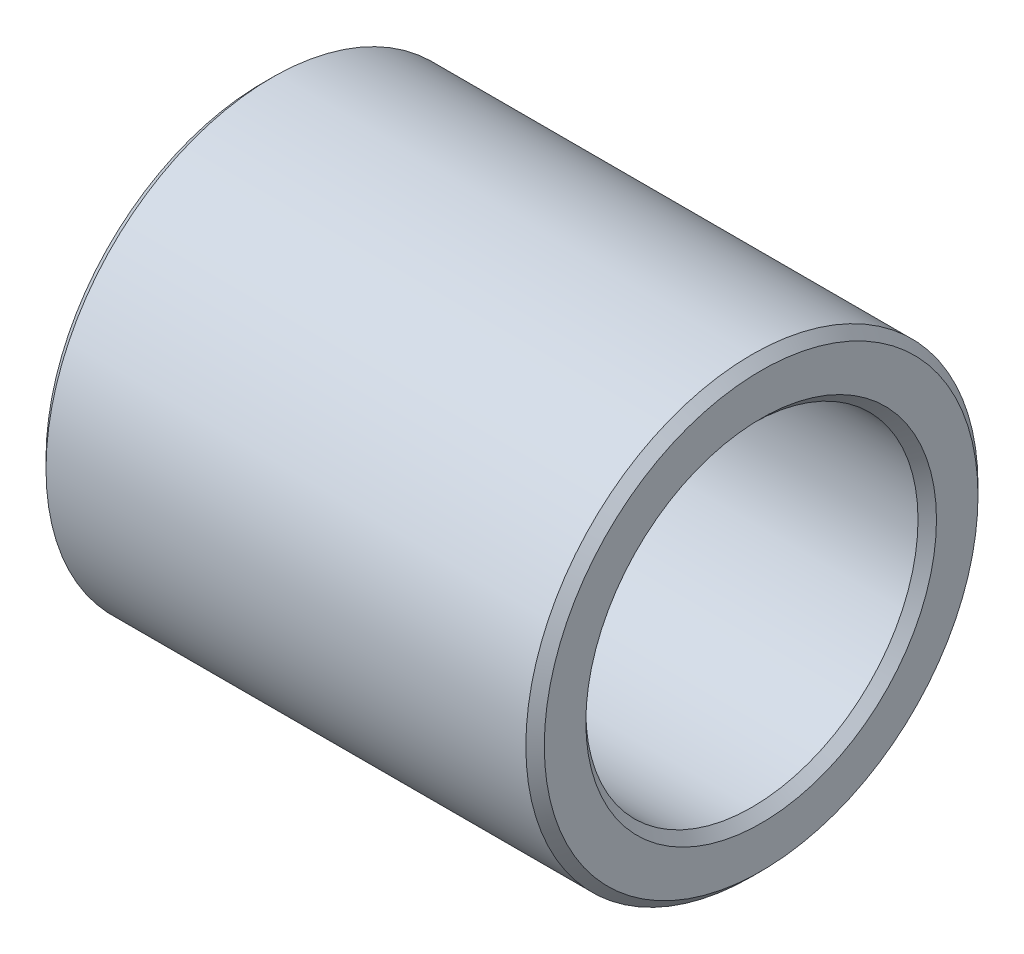
ISO-10303-21;
HEADER;
FILE_DESCRIPTION(('STEP AP214'),'2;1');
FILE_NAME('part.step','',(''),(''),'','','');
FILE_SCHEMA(('AUTOMOTIVE_DESIGN { 1 0 10303 214 1 1 1 1 }'));
ENDSEC;
DATA;
#1=APPLICATION_CONTEXT('core data for automotive mechanical design processes');
#2=APPLICATION_PROTOCOL_DEFINITION('international standard','automotive_design',2000,#1);
#3=PRODUCT_CONTEXT('',#1,'mechanical');
#4=PRODUCT('Part','Part','',(#3));
#5=PRODUCT_RELATED_PRODUCT_CATEGORY('part','',(#4));
#6=PRODUCT_DEFINITION_FORMATION('','',#4);
#7=PRODUCT_DEFINITION_CONTEXT('part definition',#1,'design');
#8=PRODUCT_DEFINITION('design','',#6,#7);
#9=PRODUCT_DEFINITION_SHAPE('','',#8);
#10=(LENGTH_UNIT() NAMED_UNIT(*) SI_UNIT(.MILLI.,.METRE.));
#11=(NAMED_UNIT(*) PLANE_ANGLE_UNIT() SI_UNIT($,.RADIAN.));
#12=(NAMED_UNIT(*) SI_UNIT($,.STERADIAN.) SOLID_ANGLE_UNIT());
#13=UNCERTAINTY_MEASURE_WITH_UNIT(LENGTH_MEASURE(1.E-05),#10,'distance_accuracy_value','');
#14=(GEOMETRIC_REPRESENTATION_CONTEXT(3) GLOBAL_UNCERTAINTY_ASSIGNED_CONTEXT((#13)) GLOBAL_UNIT_ASSIGNED_CONTEXT((#10,
#11,#12)) REPRESENTATION_CONTEXT('',''));
#15=CARTESIAN_POINT('',(0.,0.,0.));
#16=DIRECTION('',(0.,0.,1.));
#17=DIRECTION('',(1.,0.,0.));
#18=AXIS2_PLACEMENT_3D('',#15,#16,#17);
#19=CARTESIAN_POINT('',(0.,0.,0.));
#20=DIRECTION('',(-1.,0.,0.));
#21=DIRECTION('',(0.,0.,1.));
#22=AXIS2_PLACEMENT_3D('',#19,#20,#21);
#23=CYLINDRICAL_SURFACE('',#22,9.00000000000001);
#24=CARTESIAN_POINT('',(-13.,0.,0.));
#25=DIRECTION('',(-1.,0.,0.));
#26=DIRECTION('',(0.,0.,1.));
#27=AXIS2_PLACEMENT_3D('',#24,#25,#26);
#28=CIRCLE('',#27,9.00000000000001);
#29=CARTESIAN_POINT('',(-13.,0.,9.00000000000001));
#30=VERTEX_POINT('',#29);
#31=EDGE_CURVE('E56',#30,#30,#28,.T.);
#32=ORIENTED_EDGE('',*,*,#31,.T.);
#33=EDGE_LOOP('',(#32));
#34=FACE_BOUND('',#33,.T.);
#35=CARTESIAN_POINT('',(13.,0.,0.));
#36=DIRECTION('',(1.,0.,0.));
#37=DIRECTION('',(0.,0.,-1.));
#38=AXIS2_PLACEMENT_3D('',#35,#36,#37);
#39=CIRCLE('',#38,9.00000000000001);
#40=CARTESIAN_POINT('',(13.,0.,-9.00000000000001));
#41=VERTEX_POINT('',#40);
#42=EDGE_CURVE('E59',#41,#41,#39,.T.);
#43=ORIENTED_EDGE('',*,*,#42,.T.);
#44=EDGE_LOOP('',(#43));
#45=FACE_BOUND('',#44,.T.);
#46=ADVANCED_FACE('F31',(#34,#45),#23,.F.);
#47=CARTESIAN_POINT('',(-13.5,9.,0.));
#48=DIRECTION('',(-1.,0.,0.));
#49=DIRECTION('',(0.,0.,1.));
#50=AXIS2_PLACEMENT_3D('',#47,#48,#49);
#51=PLANE('',#50);
#52=CARTESIAN_POINT('',(-13.5,0.,0.));
#53=DIRECTION('',(-1.,0.,0.));
#54=DIRECTION('',(0.,0.,1.));
#55=AXIS2_PLACEMENT_3D('',#52,#53,#54);
#56=CIRCLE('',#55,9.50000000000001);
#57=CARTESIAN_POINT('',(-13.5,0.,9.50000000000001));
#58=VERTEX_POINT('',#57);
#59=EDGE_CURVE('E50',#58,#58,#56,.F.);
#60=ORIENTED_EDGE('',*,*,#59,.T.);
#61=EDGE_LOOP('',(#60));
#62=FACE_BOUND('',#61,.T.);
#63=CARTESIAN_POINT('',(-13.5,0.,0.));
#64=DIRECTION('',(-1.,0.,0.));
#65=DIRECTION('',(0.,0.,1.));
#66=AXIS2_PLACEMENT_3D('',#63,#64,#65);
#67=CIRCLE('',#66,11.75);
#68=CARTESIAN_POINT('',(-13.5,0.,11.75));
#69=VERTEX_POINT('',#68);
#70=EDGE_CURVE('E53',#69,#69,#67,.T.);
#71=ORIENTED_EDGE('',*,*,#70,.T.);
#72=EDGE_LOOP('',(#71));
#73=FACE_BOUND('',#72,.T.);
#74=ADVANCED_FACE('F89',(#62,#73),#51,.T.);
#75=CARTESIAN_POINT('',(0.,0.,0.));
#76=DIRECTION('',(-1.,0.,0.));
#77=DIRECTION('',(0.,0.,1.));
#78=AXIS2_PLACEMENT_3D('',#75,#76,#77);
#79=CYLINDRICAL_SURFACE('',#78,12.25);
#80=CARTESIAN_POINT('',(-13.,0.,0.));
#81=DIRECTION('',(-1.,0.,0.));
#82=DIRECTION('',(0.,0.,1.));
#83=AXIS2_PLACEMENT_3D('',#80,#81,#82);
#84=CIRCLE('',#83,12.25);
#85=CARTESIAN_POINT('',(-13.,0.,12.25));
#86=VERTEX_POINT('',#85);
#87=EDGE_CURVE('E10',#86,#86,#84,.F.);
#88=ORIENTED_EDGE('',*,*,#87,.T.);
#89=EDGE_LOOP('',(#88));
#90=FACE_BOUND('',#89,.T.);
#91=CARTESIAN_POINT('',(13.,0.,0.));
#92=DIRECTION('',(1.,0.,0.));
#93=DIRECTION('',(0.,0.,-1.));
#94=AXIS2_PLACEMENT_3D('',#91,#92,#93);
#95=CIRCLE('',#94,12.25);
#96=CARTESIAN_POINT('',(13.,0.,-12.25));
#97=VERTEX_POINT('',#96);
#98=EDGE_CURVE('E37',#97,#97,#95,.F.);
#99=ORIENTED_EDGE('',*,*,#98,.T.);
#100=EDGE_LOOP('',(#99));
#101=FACE_BOUND('',#100,.T.);
#102=ADVANCED_FACE('F75',(#90,#101),#79,.T.);
#103=CARTESIAN_POINT('',(13.5,12.25,0.));
#104=DIRECTION('',(1.,0.,0.));
#105=DIRECTION('',(0.,0.,-1.));
#106=AXIS2_PLACEMENT_3D('',#103,#104,#105);
#107=PLANE('',#106);
#108=CARTESIAN_POINT('',(13.5,0.,0.));
#109=DIRECTION('',(1.,0.,0.));
#110=DIRECTION('',(0.,0.,-1.));
#111=AXIS2_PLACEMENT_3D('',#108,#109,#110);
#112=CIRCLE('',#111,9.50000000000001);
#113=CARTESIAN_POINT('',(13.5,0.,-9.50000000000001));
#114=VERTEX_POINT('',#113);
#115=EDGE_CURVE('E41',#114,#114,#112,.F.);
#116=ORIENTED_EDGE('',*,*,#115,.T.);
#117=EDGE_LOOP('',(#116));
#118=FACE_BOUND('',#117,.T.);
#119=CARTESIAN_POINT('',(13.5,0.,0.));
#120=DIRECTION('',(1.,0.,0.));
#121=DIRECTION('',(0.,0.,-1.));
#122=AXIS2_PLACEMENT_3D('',#119,#120,#121);
#123=CIRCLE('',#122,11.75);
#124=CARTESIAN_POINT('',(13.5,0.,-11.75));
#125=VERTEX_POINT('',#124);
#126=EDGE_CURVE('E45',#125,#125,#123,.T.);
#127=ORIENTED_EDGE('',*,*,#126,.T.);
#128=EDGE_LOOP('',(#127));
#129=FACE_BOUND('',#128,.T.);
#130=ADVANCED_FACE('F72',(#118,#129),#107,.T.);
#131=CARTESIAN_POINT('',(-13.,0.,0.));
#132=DIRECTION('',(-1.,0.,0.));
#133=DIRECTION('',(0.,0.,1.));
#134=AXIS2_PLACEMENT_3D('',#131,#132,#133);
#135=CONICAL_SURFACE('',#134,9.00000000000001,0.785398163397443);
#136=ORIENTED_EDGE('',*,*,#59,.F.);
#137=EDGE_LOOP('',(#136));
#138=FACE_BOUND('',#137,.T.);
#139=ORIENTED_EDGE('',*,*,#31,.F.);
#140=EDGE_LOOP('',(#139));
#141=FACE_BOUND('',#140,.T.);
#142=ADVANCED_FACE('F68',(#138,#141),#135,.F.);
#143=CARTESIAN_POINT('',(13.5,0.,0.));
#144=DIRECTION('',(1.,0.,0.));
#145=DIRECTION('',(0.,0.,-1.));
#146=AXIS2_PLACEMENT_3D('',#143,#144,#145);
#147=CONICAL_SURFACE('',#146,9.50000000000001,0.785398163397453);
#148=ORIENTED_EDGE('',*,*,#42,.F.);
#149=EDGE_LOOP('',(#148));
#150=FACE_BOUND('',#149,.T.);
#151=ORIENTED_EDGE('',*,*,#115,.F.);
#152=EDGE_LOOP('',(#151));
#153=FACE_BOUND('',#152,.T.);
#154=ADVANCED_FACE('F64',(#150,#153),#147,.F.);
#155=CARTESIAN_POINT('',(-13.5,0.,0.));
#156=DIRECTION('',(1.,0.,0.));
#157=DIRECTION('',(0.,0.,-1.));
#158=AXIS2_PLACEMENT_3D('',#155,#156,#157);
#159=CONICAL_SURFACE('',#158,11.75,0.785398163397453);
#160=ORIENTED_EDGE('',*,*,#87,.F.);
#161=EDGE_LOOP('',(#160));
#162=FACE_BOUND('',#161,.T.);
#163=ORIENTED_EDGE('',*,*,#70,.F.);
#164=EDGE_LOOP('',(#163));
#165=FACE_BOUND('',#164,.T.);
#166=ADVANCED_FACE('F67',(#162,#165),#159,.T.);
#167=CARTESIAN_POINT('',(13.,0.,0.));
#168=DIRECTION('',(-1.,0.,0.));
#169=DIRECTION('',(0.,0.,1.));
#170=AXIS2_PLACEMENT_3D('',#167,#168,#169);
#171=CONICAL_SURFACE('',#170,12.25,0.785398163397443);
#172=ORIENTED_EDGE('',*,*,#126,.F.);
#173=EDGE_LOOP('',(#172));
#174=FACE_BOUND('',#173,.T.);
#175=ORIENTED_EDGE('',*,*,#98,.F.);
#176=EDGE_LOOP('',(#175));
#177=FACE_BOUND('',#176,.T.);
#178=ADVANCED_FACE('F79',(#174,#177),#171,.T.);
#179=CLOSED_SHELL('',(#46,#74,#102,#130,#142,#154,#166,#178));
#180=MANIFOLD_SOLID_BREP('B2',#179);
#181=ADVANCED_BREP_SHAPE_REPRESENTATION('',(#18,#180),#14);
#182=SHAPE_DEFINITION_REPRESENTATION(#9,#181);
ENDSEC;
END-ISO-10303-21;
